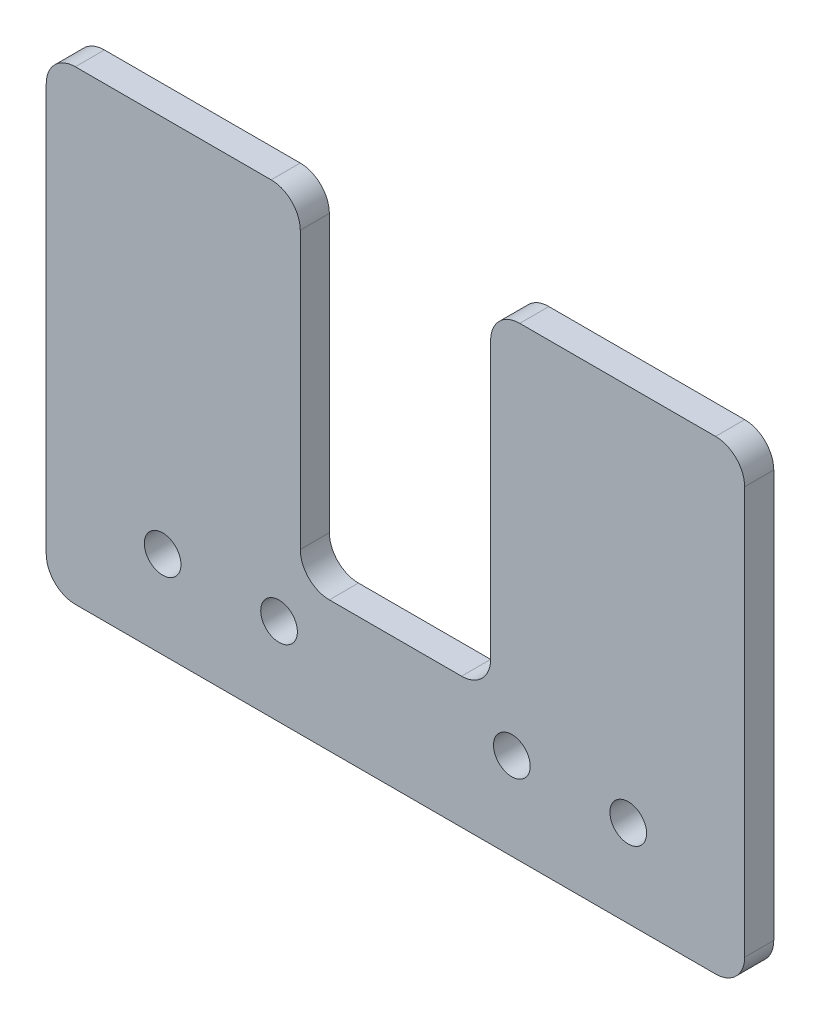
ISO-10303-21;
HEADER;
FILE_DESCRIPTION(('STEP AP214'),'2;1');
FILE_NAME('part.step','',(''),(''),'','','');
FILE_SCHEMA(('AUTOMOTIVE_DESIGN { 1 0 10303 214 1 1 1 1 }'));
ENDSEC;
DATA;
#1=APPLICATION_CONTEXT('core data for automotive mechanical design processes');
#2=APPLICATION_PROTOCOL_DEFINITION('international standard','automotive_design',2000,#1);
#3=PRODUCT_CONTEXT('',#1,'mechanical');
#4=PRODUCT('Part','Part','',(#3));
#5=PRODUCT_RELATED_PRODUCT_CATEGORY('part','',(#4));
#6=PRODUCT_DEFINITION_FORMATION('','',#4);
#7=PRODUCT_DEFINITION_CONTEXT('part definition',#1,'design');
#8=PRODUCT_DEFINITION('design','',#6,#7);
#9=PRODUCT_DEFINITION_SHAPE('','',#8);
#10=(LENGTH_UNIT() NAMED_UNIT(*) SI_UNIT(.MILLI.,.METRE.));
#11=(NAMED_UNIT(*) PLANE_ANGLE_UNIT() SI_UNIT($,.RADIAN.));
#12=(NAMED_UNIT(*) SI_UNIT($,.STERADIAN.) SOLID_ANGLE_UNIT());
#13=UNCERTAINTY_MEASURE_WITH_UNIT(LENGTH_MEASURE(1.E-05),#10,'distance_accuracy_value','');
#14=(GEOMETRIC_REPRESENTATION_CONTEXT(3) GLOBAL_UNCERTAINTY_ASSIGNED_CONTEXT((#13)) GLOBAL_UNIT_ASSIGNED_CONTEXT((#10,
#11,#12)) REPRESENTATION_CONTEXT('',''));
#15=CARTESIAN_POINT('',(0.,0.,0.));
#16=DIRECTION('',(0.,0.,1.));
#17=DIRECTION('',(1.,0.,0.));
#18=AXIS2_PLACEMENT_3D('',#15,#16,#17);
#19=CARTESIAN_POINT('',(38.1,0.,-30.95625));
#20=DIRECTION('',(-1.,0.,0.));
#21=DIRECTION('',(0.,0.,1.));
#22=AXIS2_PLACEMENT_3D('',#19,#20,#21);
#23=PLANE('',#22);
#24=DIRECTION('',(0.,-1.,0.));
#25=VECTOR('',#24,1.);
#26=CARTESIAN_POINT('',(38.1,0.,-27.78125));
#27=LINE('',#26,#25);
#28=CARTESIAN_POINT('',(38.1,26.8,-27.78125));
#29=VERTEX_POINT('',#28);
#30=CARTESIAN_POINT('',(38.1,-17.65,-27.78125));
#31=VERTEX_POINT('',#30);
#32=EDGE_CURVE('E221',#29,#31,#27,.T.);
#33=ORIENTED_EDGE('',*,*,#32,.T.);
#34=DIRECTION('',(0.,0.,1.));
#35=VECTOR('',#34,1.);
#36=CARTESIAN_POINT('',(38.1,-17.65,-30.95625));
#37=LINE('',#36,#35);
#38=CARTESIAN_POINT('',(38.1,-17.65,-30.95625));
#39=VERTEX_POINT('',#38);
#40=EDGE_CURVE('E72',#31,#39,#37,.F.);
#41=ORIENTED_EDGE('',*,*,#40,.T.);
#42=DIRECTION('',(0.,-1.,0.));
#43=VECTOR('',#42,1.);
#44=CARTESIAN_POINT('',(38.1,0.,-30.95625));
#45=LINE('',#44,#43);
#46=CARTESIAN_POINT('',(38.1,26.8,-30.95625));
#47=VERTEX_POINT('',#46);
#48=EDGE_CURVE('E291',#47,#39,#45,.T.);
#49=ORIENTED_EDGE('',*,*,#48,.F.);
#50=DIRECTION('',(0.,0.,1.));
#51=VECTOR('',#50,1.);
#52=CARTESIAN_POINT('',(38.1,26.8,-30.95625));
#53=LINE('',#52,#51);
#54=EDGE_CURVE('E208',#47,#29,#53,.T.);
#55=ORIENTED_EDGE('',*,*,#54,.T.);
#56=EDGE_LOOP('',(#33,#41,#49,#55));
#57=FACE_BOUND('',#56,.T.);
#58=ADVANCED_FACE('F49',(#57),#23,.F.);
#59=CARTESIAN_POINT('',(0.,-20.825,-30.95625));
#60=DIRECTION('',(0.,1.,0.));
#61=DIRECTION('',(-1.,0.,0.));
#62=AXIS2_PLACEMENT_3D('',#59,#60,#61);
#63=PLANE('',#62);
#64=DIRECTION('',(-1.,0.,0.));
#65=VECTOR('',#64,1.);
#66=CARTESIAN_POINT('',(0.,-20.825,-30.95625));
#67=LINE('',#66,#65);
#68=CARTESIAN_POINT('',(34.925,-20.825,-30.95625));
#69=VERTEX_POINT('',#68);
#70=CARTESIAN_POINT('',(-34.925,-20.825,-30.95625));
#71=VERTEX_POINT('',#70);
#72=EDGE_CURVE('E170',#69,#71,#67,.T.);
#73=ORIENTED_EDGE('',*,*,#72,.F.);
#74=DIRECTION('',(0.,0.,1.));
#75=VECTOR('',#74,1.);
#76=CARTESIAN_POINT('',(34.925,-20.825,-30.95625));
#77=LINE('',#76,#75);
#78=CARTESIAN_POINT('',(34.925,-20.825,-27.78125));
#79=VERTEX_POINT('',#78);
#80=EDGE_CURVE('E281',#69,#79,#77,.T.);
#81=ORIENTED_EDGE('',*,*,#80,.T.);
#82=DIRECTION('',(-1.,0.,0.));
#83=VECTOR('',#82,1.);
#84=CARTESIAN_POINT('',(0.,-20.825,-27.78125));
#85=LINE('',#84,#83);
#86=CARTESIAN_POINT('',(-34.925,-20.825,-27.78125));
#87=VERTEX_POINT('',#86);
#88=EDGE_CURVE('E223',#79,#87,#85,.T.);
#89=ORIENTED_EDGE('',*,*,#88,.T.);
#90=DIRECTION('',(0.,0.,1.));
#91=VECTOR('',#90,1.);
#92=CARTESIAN_POINT('',(-34.925,-20.825,-30.95625));
#93=LINE('',#92,#91);
#94=EDGE_CURVE('E179',#87,#71,#93,.F.);
#95=ORIENTED_EDGE('',*,*,#94,.T.);
#96=EDGE_LOOP('',(#73,#81,#89,#95));
#97=FACE_BOUND('',#96,.T.);
#98=ADVANCED_FACE('F295',(#97),#63,.F.);
#99=CARTESIAN_POINT('',(-38.1,0.,-30.95625));
#100=DIRECTION('',(1.,0.,0.));
#101=DIRECTION('',(0.,0.,-1.));
#102=AXIS2_PLACEMENT_3D('',#99,#100,#101);
#103=PLANE('',#102);
#104=DIRECTION('',(0.,1.,0.));
#105=VECTOR('',#104,1.);
#106=CARTESIAN_POINT('',(-38.1,0.,-30.95625));
#107=LINE('',#106,#105);
#108=CARTESIAN_POINT('',(-38.1,-17.65,-30.95625));
#109=VERTEX_POINT('',#108);
#110=CARTESIAN_POINT('',(-38.1,26.8,-30.95625));
#111=VERTEX_POINT('',#110);
#112=EDGE_CURVE('E162',#109,#111,#107,.T.);
#113=ORIENTED_EDGE('',*,*,#112,.F.);
#114=DIRECTION('',(0.,0.,1.));
#115=VECTOR('',#114,1.);
#116=CARTESIAN_POINT('',(-38.1,-17.65,-30.95625));
#117=LINE('',#116,#115);
#118=CARTESIAN_POINT('',(-38.1,-17.65,-27.78125));
#119=VERTEX_POINT('',#118);
#120=EDGE_CURVE('E12',#109,#119,#117,.T.);
#121=ORIENTED_EDGE('',*,*,#120,.T.);
#122=DIRECTION('',(0.,1.,0.));
#123=VECTOR('',#122,1.);
#124=CARTESIAN_POINT('',(-38.1,0.,-27.78125));
#125=LINE('',#124,#123);
#126=CARTESIAN_POINT('',(-38.1,26.8,-27.78125));
#127=VERTEX_POINT('',#126);
#128=EDGE_CURVE('E176',#119,#127,#125,.T.);
#129=ORIENTED_EDGE('',*,*,#128,.T.);
#130=DIRECTION('',(0.,0.,1.));
#131=VECTOR('',#130,1.);
#132=CARTESIAN_POINT('',(-38.1,26.8,-30.95625));
#133=LINE('',#132,#131);
#134=EDGE_CURVE('E173',#111,#127,#133,.T.);
#135=ORIENTED_EDGE('',*,*,#134,.F.);
#136=EDGE_LOOP('',(#113,#121,#129,#135));
#137=FACE_BOUND('',#136,.T.);
#138=ADVANCED_FACE('F174',(#137),#103,.F.);
#139=CARTESIAN_POINT('',(-34.925,26.8,-30.95625));
#140=DIRECTION('',(0.,0.,1.));
#141=DIRECTION('',(1.,0.,0.));
#142=AXIS2_PLACEMENT_3D('',#139,#140,#141);
#143=CYLINDRICAL_SURFACE('',#142,3.175);
#144=CARTESIAN_POINT('',(-34.925,26.8,-27.78125));
#145=DIRECTION('',(0.,0.,-1.));
#146=DIRECTION('',(-1.,0.,0.));
#147=AXIS2_PLACEMENT_3D('',#144,#145,#146);
#148=CIRCLE('',#147,3.175);
#149=CARTESIAN_POINT('',(-34.925,29.975,-27.78125));
#150=VERTEX_POINT('',#149);
#151=EDGE_CURVE('E227',#127,#150,#148,.T.);
#152=ORIENTED_EDGE('',*,*,#151,.T.);
#153=DIRECTION('',(0.,0.,1.));
#154=VECTOR('',#153,1.);
#155=CARTESIAN_POINT('',(-34.925,29.975,-30.95625));
#156=LINE('',#155,#154);
#157=CARTESIAN_POINT('',(-34.925,29.975,-30.95625));
#158=VERTEX_POINT('',#157);
#159=EDGE_CURVE('E180',#158,#150,#156,.T.);
#160=ORIENTED_EDGE('',*,*,#159,.F.);
#161=CARTESIAN_POINT('',(-34.925,26.8,-30.95625));
#162=DIRECTION('',(0.,0.,-1.));
#163=DIRECTION('',(-1.,0.,0.));
#164=AXIS2_PLACEMENT_3D('',#161,#162,#163);
#165=CIRCLE('',#164,3.175);
#166=EDGE_CURVE('E166',#111,#158,#165,.T.);
#167=ORIENTED_EDGE('',*,*,#166,.F.);
#168=ORIENTED_EDGE('',*,*,#134,.T.);
#169=EDGE_LOOP('',(#152,#160,#167,#168));
#170=FACE_BOUND('',#169,.T.);
#171=ADVANCED_FACE('F182',(#170),#143,.T.);
#172=CARTESIAN_POINT('',(0.,29.975,-30.95625));
#173=DIRECTION('',(0.,-1.,0.));
#174=DIRECTION('',(0.,0.,-1.));
#175=AXIS2_PLACEMENT_3D('',#172,#173,#174);
#176=PLANE('',#175);
#177=DIRECTION('',(1.,0.,0.));
#178=VECTOR('',#177,1.);
#179=CARTESIAN_POINT('',(0.,29.975,-27.78125));
#180=LINE('',#179,#178);
#181=CARTESIAN_POINT('',(-13.561,29.975,-27.78125));
#182=VERTEX_POINT('',#181);
#183=EDGE_CURVE('E229',#150,#182,#180,.T.);
#184=ORIENTED_EDGE('',*,*,#183,.T.);
#185=DIRECTION('',(0.,0.,1.));
#186=VECTOR('',#185,1.);
#187=CARTESIAN_POINT('',(-13.561,29.975,-30.95625));
#188=LINE('',#187,#186);
#189=CARTESIAN_POINT('',(-13.561,29.975,-30.95625));
#190=VERTEX_POINT('',#189);
#191=EDGE_CURVE('E276',#190,#182,#188,.T.);
#192=ORIENTED_EDGE('',*,*,#191,.F.);
#193=DIRECTION('',(1.,0.,0.));
#194=VECTOR('',#193,1.);
#195=CARTESIAN_POINT('',(0.,29.975,-30.95625));
#196=LINE('',#195,#194);
#197=EDGE_CURVE('E185',#158,#190,#196,.T.);
#198=ORIENTED_EDGE('',*,*,#197,.F.);
#199=ORIENTED_EDGE('',*,*,#159,.T.);
#200=EDGE_LOOP('',(#184,#192,#198,#199));
#201=FACE_BOUND('',#200,.T.);
#202=ADVANCED_FACE('F350',(#201),#176,.F.);
#203=CARTESIAN_POINT('',(-13.561,26.8,-30.95625));
#204=DIRECTION('',(0.,0.,1.));
#205=DIRECTION('',(1.,0.,0.));
#206=AXIS2_PLACEMENT_3D('',#203,#204,#205);
#207=CYLINDRICAL_SURFACE('',#206,3.175);
#208=CARTESIAN_POINT('',(-13.561,26.8,-27.78125));
#209=DIRECTION('',(0.,0.,-1.));
#210=DIRECTION('',(-1.,0.,0.));
#211=AXIS2_PLACEMENT_3D('',#208,#209,#210);
#212=CIRCLE('',#211,3.175);
#213=CARTESIAN_POINT('',(-10.386,26.8,-27.78125));
#214=VERTEX_POINT('',#213);
#215=EDGE_CURVE('E231',#182,#214,#212,.T.);
#216=ORIENTED_EDGE('',*,*,#215,.T.);
#217=DIRECTION('',(0.,0.,1.));
#218=VECTOR('',#217,1.);
#219=CARTESIAN_POINT('',(-10.386,26.8,-30.95625));
#220=LINE('',#219,#218);
#221=CARTESIAN_POINT('',(-10.386,26.8,-30.95625));
#222=VERTEX_POINT('',#221);
#223=EDGE_CURVE('E273',#222,#214,#220,.T.);
#224=ORIENTED_EDGE('',*,*,#223,.F.);
#225=CARTESIAN_POINT('',(-13.561,26.8,-30.95625));
#226=DIRECTION('',(0.,0.,-1.));
#227=DIRECTION('',(-1.,0.,0.));
#228=AXIS2_PLACEMENT_3D('',#225,#226,#227);
#229=CIRCLE('',#228,3.175);
#230=EDGE_CURVE('E187',#190,#222,#229,.T.);
#231=ORIENTED_EDGE('',*,*,#230,.F.);
#232=ORIENTED_EDGE('',*,*,#191,.T.);
#233=EDGE_LOOP('',(#216,#224,#231,#232));
#234=FACE_BOUND('',#233,.T.);
#235=ADVANCED_FACE('F347',(#234),#207,.T.);
#236=CARTESIAN_POINT('',(-10.386,0.,-30.95625));
#237=DIRECTION('',(-1.,0.,0.));
#238=DIRECTION('',(0.,-1.,0.));
#239=AXIS2_PLACEMENT_3D('',#236,#237,#238);
#240=PLANE('',#239);
#241=DIRECTION('',(0.,-1.,0.));
#242=VECTOR('',#241,1.);
#243=CARTESIAN_POINT('',(-10.386,0.,-27.78125));
#244=LINE('',#243,#242);
#245=CARTESIAN_POINT('',(-10.386,-3.36249999999998,-27.78125));
#246=VERTEX_POINT('',#245);
#247=EDGE_CURVE('E233',#214,#246,#244,.T.);
#248=ORIENTED_EDGE('',*,*,#247,.T.);
#249=DIRECTION('',(0.,0.,1.));
#250=VECTOR('',#249,1.);
#251=CARTESIAN_POINT('',(-10.386,-3.36249999999998,-30.95625));
#252=LINE('',#251,#250);
#253=CARTESIAN_POINT('',(-10.386,-3.36249999999998,-30.95625));
#254=VERTEX_POINT('',#253);
#255=EDGE_CURVE('E270',#254,#246,#252,.T.);
#256=ORIENTED_EDGE('',*,*,#255,.F.);
#257=DIRECTION('',(0.,-1.,0.));
#258=VECTOR('',#257,1.);
#259=CARTESIAN_POINT('',(-10.386,0.,-30.95625));
#260=LINE('',#259,#258);
#261=EDGE_CURVE('E192',#222,#254,#260,.T.);
#262=ORIENTED_EDGE('',*,*,#261,.F.);
#263=ORIENTED_EDGE('',*,*,#223,.T.);
#264=EDGE_LOOP('',(#248,#256,#262,#263));
#265=FACE_BOUND('',#264,.T.);
#266=ADVANCED_FACE('F342',(#265),#240,.F.);
#267=CARTESIAN_POINT('',(-7.21099999999999,-3.36249999999998,-30.95625));
#268=DIRECTION('',(0.,0.,1.));
#269=DIRECTION('',(1.,0.,0.));
#270=AXIS2_PLACEMENT_3D('',#267,#268,#269);
#271=CYLINDRICAL_SURFACE('',#270,3.175);
#272=CARTESIAN_POINT('',(-7.21099999999999,-3.36249999999998,-27.78125));
#273=DIRECTION('',(0.,0.,-1.));
#274=DIRECTION('',(-1.,0.,0.));
#275=AXIS2_PLACEMENT_3D('',#272,#273,#274);
#276=CIRCLE('',#275,3.175);
#277=CARTESIAN_POINT('',(-7.21099999999999,-6.53749999999998,-27.78125));
#278=VERTEX_POINT('',#277);
#279=EDGE_CURVE('E235',#246,#278,#276,.F.);
#280=ORIENTED_EDGE('',*,*,#279,.T.);
#281=DIRECTION('',(0.,0.,1.));
#282=VECTOR('',#281,1.);
#283=CARTESIAN_POINT('',(-7.21099999999999,-6.53749999999998,-30.95625));
#284=LINE('',#283,#282);
#285=CARTESIAN_POINT('',(-7.21099999999999,-6.53749999999998,-30.95625));
#286=VERTEX_POINT('',#285);
#287=EDGE_CURVE('E267',#286,#278,#284,.T.);
#288=ORIENTED_EDGE('',*,*,#287,.F.);
#289=CARTESIAN_POINT('',(-7.21099999999999,-3.36249999999998,-30.95625));
#290=DIRECTION('',(0.,0.,-1.));
#291=DIRECTION('',(-1.,0.,0.));
#292=AXIS2_PLACEMENT_3D('',#289,#290,#291);
#293=CIRCLE('',#292,3.175);
#294=EDGE_CURVE('E194',#254,#286,#293,.F.);
#295=ORIENTED_EDGE('',*,*,#294,.F.);
#296=ORIENTED_EDGE('',*,*,#255,.T.);
#297=EDGE_LOOP('',(#280,#288,#295,#296));
#298=FACE_BOUND('',#297,.T.);
#299=ADVANCED_FACE('F336',(#298),#271,.F.);
#300=CARTESIAN_POINT('',(0.,-6.53749999999998,-30.95625));
#301=DIRECTION('',(0.,-1.,0.));
#302=DIRECTION('',(0.,0.,-1.));
#303=AXIS2_PLACEMENT_3D('',#300,#301,#302);
#304=PLANE('',#303);
#305=DIRECTION('',(1.,0.,0.));
#306=VECTOR('',#305,1.);
#307=CARTESIAN_POINT('',(0.,-6.53749999999998,-27.78125));
#308=LINE('',#307,#306);
#309=CARTESIAN_POINT('',(7.21099999999999,-6.53749999999998,-27.78125));
#310=VERTEX_POINT('',#309);
#311=EDGE_CURVE('E237',#278,#310,#308,.T.);
#312=ORIENTED_EDGE('',*,*,#311,.T.);
#313=DIRECTION('',(0.,0.,1.));
#314=VECTOR('',#313,1.);
#315=CARTESIAN_POINT('',(7.21099999999999,-6.53749999999998,-30.95625));
#316=LINE('',#315,#314);
#317=CARTESIAN_POINT('',(7.21099999999999,-6.53749999999998,-30.95625));
#318=VERTEX_POINT('',#317);
#319=EDGE_CURVE('E264',#318,#310,#316,.T.);
#320=ORIENTED_EDGE('',*,*,#319,.F.);
#321=DIRECTION('',(1.,0.,0.));
#322=VECTOR('',#321,1.);
#323=CARTESIAN_POINT('',(0.,-6.53749999999998,-30.95625));
#324=LINE('',#323,#322);
#325=EDGE_CURVE('E196',#286,#318,#324,.T.);
#326=ORIENTED_EDGE('',*,*,#325,.F.);
#327=ORIENTED_EDGE('',*,*,#287,.T.);
#328=EDGE_LOOP('',(#312,#320,#326,#327));
#329=FACE_BOUND('',#328,.T.);
#330=ADVANCED_FACE('F332',(#329),#304,.F.);
#331=CARTESIAN_POINT('',(7.21099999999999,-3.36249999999998,-30.95625));
#332=DIRECTION('',(0.,0.,1.));
#333=DIRECTION('',(1.,0.,0.));
#334=AXIS2_PLACEMENT_3D('',#331,#332,#333);
#335=CYLINDRICAL_SURFACE('',#334,3.175);
#336=CARTESIAN_POINT('',(7.21099999999999,-3.36249999999998,-27.78125));
#337=DIRECTION('',(0.,0.,-1.));
#338=DIRECTION('',(-1.,0.,0.));
#339=AXIS2_PLACEMENT_3D('',#336,#337,#338);
#340=CIRCLE('',#339,3.175);
#341=CARTESIAN_POINT('',(10.386,-3.36249999999998,-27.78125));
#342=VERTEX_POINT('',#341);
#343=EDGE_CURVE('E239',#310,#342,#340,.F.);
#344=ORIENTED_EDGE('',*,*,#343,.T.);
#345=DIRECTION('',(0.,0.,1.));
#346=VECTOR('',#345,1.);
#347=CARTESIAN_POINT('',(10.386,-3.36249999999998,-30.95625));
#348=LINE('',#347,#346);
#349=CARTESIAN_POINT('',(10.386,-3.36249999999998,-30.95625));
#350=VERTEX_POINT('',#349);
#351=EDGE_CURVE('E261',#350,#342,#348,.T.);
#352=ORIENTED_EDGE('',*,*,#351,.F.);
#353=CARTESIAN_POINT('',(7.21099999999999,-3.36249999999998,-30.95625));
#354=DIRECTION('',(0.,0.,-1.));
#355=DIRECTION('',(-1.,0.,0.));
#356=AXIS2_PLACEMENT_3D('',#353,#354,#355);
#357=CIRCLE('',#356,3.175);
#358=EDGE_CURVE('E198',#318,#350,#357,.F.);
#359=ORIENTED_EDGE('',*,*,#358,.F.);
#360=ORIENTED_EDGE('',*,*,#319,.T.);
#361=EDGE_LOOP('',(#344,#352,#359,#360));
#362=FACE_BOUND('',#361,.T.);
#363=ADVANCED_FACE('F327',(#362),#335,.F.);
#364=CARTESIAN_POINT('',(10.386,0.,-30.95625));
#365=DIRECTION('',(1.,0.,0.));
#366=DIRECTION('',(0.,0.,-1.));
#367=AXIS2_PLACEMENT_3D('',#364,#365,#366);
#368=PLANE('',#367);
#369=DIRECTION('',(0.,1.,0.));
#370=VECTOR('',#369,1.);
#371=CARTESIAN_POINT('',(10.386,0.,-27.78125));
#372=LINE('',#371,#370);
#373=CARTESIAN_POINT('',(10.386,26.8,-27.78125));
#374=VERTEX_POINT('',#373);
#375=EDGE_CURVE('E241',#342,#374,#372,.T.);
#376=ORIENTED_EDGE('',*,*,#375,.T.);
#377=DIRECTION('',(0.,0.,1.));
#378=VECTOR('',#377,1.);
#379=CARTESIAN_POINT('',(10.386,26.8,-30.95625));
#380=LINE('',#379,#378);
#381=CARTESIAN_POINT('',(10.386,26.8,-30.95625));
#382=VERTEX_POINT('',#381);
#383=EDGE_CURVE('E258',#382,#374,#380,.T.);
#384=ORIENTED_EDGE('',*,*,#383,.F.);
#385=DIRECTION('',(0.,1.,0.));
#386=VECTOR('',#385,1.);
#387=CARTESIAN_POINT('',(10.386,0.,-30.95625));
#388=LINE('',#387,#386);
#389=EDGE_CURVE('E200',#350,#382,#388,.T.);
#390=ORIENTED_EDGE('',*,*,#389,.F.);
#391=ORIENTED_EDGE('',*,*,#351,.T.);
#392=EDGE_LOOP('',(#376,#384,#390,#391));
#393=FACE_BOUND('',#392,.T.);
#394=ADVANCED_FACE('F321',(#393),#368,.F.);
#395=CARTESIAN_POINT('',(13.561,26.8,-30.95625));
#396=DIRECTION('',(0.,0.,1.));
#397=DIRECTION('',(1.,0.,0.));
#398=AXIS2_PLACEMENT_3D('',#395,#396,#397);
#399=CYLINDRICAL_SURFACE('',#398,3.175);
#400=CARTESIAN_POINT('',(13.561,26.8,-27.78125));
#401=DIRECTION('',(0.,0.,-1.));
#402=DIRECTION('',(-1.,0.,0.));
#403=AXIS2_PLACEMENT_3D('',#400,#401,#402);
#404=CIRCLE('',#403,3.175);
#405=CARTESIAN_POINT('',(13.561,29.975,-27.78125));
#406=VERTEX_POINT('',#405);
#407=EDGE_CURVE('E243',#374,#406,#404,.T.);
#408=ORIENTED_EDGE('',*,*,#407,.T.);
#409=DIRECTION('',(0.,0.,1.));
#410=VECTOR('',#409,1.);
#411=CARTESIAN_POINT('',(13.561,29.975,-30.95625));
#412=LINE('',#411,#410);
#413=CARTESIAN_POINT('',(13.561,29.975,-30.95625));
#414=VERTEX_POINT('',#413);
#415=EDGE_CURVE('E255',#414,#406,#412,.T.);
#416=ORIENTED_EDGE('',*,*,#415,.F.);
#417=CARTESIAN_POINT('',(13.561,26.8,-30.95625));
#418=DIRECTION('',(0.,0.,-1.));
#419=DIRECTION('',(-1.,0.,0.));
#420=AXIS2_PLACEMENT_3D('',#417,#418,#419);
#421=CIRCLE('',#420,3.175);
#422=EDGE_CURVE('E202',#382,#414,#421,.T.);
#423=ORIENTED_EDGE('',*,*,#422,.F.);
#424=ORIENTED_EDGE('',*,*,#383,.T.);
#425=EDGE_LOOP('',(#408,#416,#423,#424));
#426=FACE_BOUND('',#425,.T.);
#427=ADVANCED_FACE('F317',(#426),#399,.T.);
#428=CARTESIAN_POINT('',(0.,29.975,-30.95625));
#429=DIRECTION('',(0.,-1.,0.));
#430=DIRECTION('',(1.,0.,0.));
#431=AXIS2_PLACEMENT_3D('',#428,#429,#430);
#432=PLANE('',#431);
#433=DIRECTION('',(1.,0.,0.));
#434=VECTOR('',#433,1.);
#435=CARTESIAN_POINT('',(0.,29.975,-27.78125));
#436=LINE('',#435,#434);
#437=CARTESIAN_POINT('',(34.925,29.975,-27.78125));
#438=VERTEX_POINT('',#437);
#439=EDGE_CURVE('E245',#406,#438,#436,.T.);
#440=ORIENTED_EDGE('',*,*,#439,.T.);
#441=DIRECTION('',(0.,0.,1.));
#442=VECTOR('',#441,1.);
#443=CARTESIAN_POINT('',(34.925,29.975,-30.95625));
#444=LINE('',#443,#442);
#445=CARTESIAN_POINT('',(34.925,29.975,-30.95625));
#446=VERTEX_POINT('',#445);
#447=EDGE_CURVE('E252',#446,#438,#444,.T.);
#448=ORIENTED_EDGE('',*,*,#447,.F.);
#449=DIRECTION('',(1.,0.,0.));
#450=VECTOR('',#449,1.);
#451=CARTESIAN_POINT('',(0.,29.975,-30.95625));
#452=LINE('',#451,#450);
#453=EDGE_CURVE('E204',#414,#446,#452,.T.);
#454=ORIENTED_EDGE('',*,*,#453,.F.);
#455=ORIENTED_EDGE('',*,*,#415,.T.);
#456=EDGE_LOOP('',(#440,#448,#454,#455));
#457=FACE_BOUND('',#456,.T.);
#458=ADVANCED_FACE('F312',(#457),#432,.F.);
#459=CARTESIAN_POINT('',(25.4,-11.3,-30.95625));
#460=DIRECTION('',(0.,0.,1.));
#461=DIRECTION('',(1.,0.,0.));
#462=AXIS2_PLACEMENT_3D('',#459,#460,#461);
#463=CYLINDRICAL_SURFACE('',#462,2.);
#464=CARTESIAN_POINT('',(25.4,-11.3,-30.95625));
#465=DIRECTION('',(0.,0.,-1.));
#466=DIRECTION('',(-1.,0.,0.));
#467=AXIS2_PLACEMENT_3D('',#464,#465,#466);
#468=CIRCLE('',#467,2.);
#469=CARTESIAN_POINT('',(23.4,-11.3,-30.95625));
#470=VERTEX_POINT('',#469);
#471=EDGE_CURVE('E599',#470,#470,#468,.T.);
#472=ORIENTED_EDGE('',*,*,#471,.T.);
#473=EDGE_LOOP('',(#472));
#474=FACE_BOUND('',#473,.T.);
#475=CARTESIAN_POINT('',(25.4,-11.3,-27.78125));
#476=DIRECTION('',(0.,0.,-1.));
#477=DIRECTION('',(-1.,0.,0.));
#478=AXIS2_PLACEMENT_3D('',#475,#476,#477);
#479=CIRCLE('',#478,2.);
#480=CARTESIAN_POINT('',(23.4,-11.3,-27.78125));
#481=VERTEX_POINT('',#480);
#482=EDGE_CURVE('E218',#481,#481,#479,.T.);
#483=ORIENTED_EDGE('',*,*,#482,.F.);
#484=EDGE_LOOP('',(#483));
#485=FACE_BOUND('',#484,.T.);
#486=ADVANCED_FACE('F365',(#474,#485),#463,.F.);
#487=CARTESIAN_POINT('',(12.7,-11.3,-30.95625));
#488=DIRECTION('',(0.,0.,1.));
#489=DIRECTION('',(1.,0.,0.));
#490=AXIS2_PLACEMENT_3D('',#487,#488,#489);
#491=CYLINDRICAL_SURFACE('',#490,2.);
#492=CARTESIAN_POINT('',(12.7,-11.3,-30.95625));
#493=DIRECTION('',(0.,0.,-1.));
#494=DIRECTION('',(-1.,0.,0.));
#495=AXIS2_PLACEMENT_3D('',#492,#493,#494);
#496=CIRCLE('',#495,2.);
#497=CARTESIAN_POINT('',(10.7,-11.3,-30.95625));
#498=VERTEX_POINT('',#497);
#499=EDGE_CURVE('E596',#498,#498,#496,.T.);
#500=ORIENTED_EDGE('',*,*,#499,.T.);
#501=EDGE_LOOP('',(#500));
#502=FACE_BOUND('',#501,.T.);
#503=CARTESIAN_POINT('',(12.7,-11.3,-27.78125));
#504=DIRECTION('',(0.,0.,-1.));
#505=DIRECTION('',(-1.,0.,0.));
#506=AXIS2_PLACEMENT_3D('',#503,#504,#505);
#507=CIRCLE('',#506,2.);
#508=CARTESIAN_POINT('',(10.7,-11.3,-27.78125));
#509=VERTEX_POINT('',#508);
#510=EDGE_CURVE('E215',#509,#509,#507,.T.);
#511=ORIENTED_EDGE('',*,*,#510,.F.);
#512=EDGE_LOOP('',(#511));
#513=FACE_BOUND('',#512,.T.);
#514=ADVANCED_FACE('F368',(#502,#513),#491,.F.);
#515=CARTESIAN_POINT('',(-12.7,-11.3,-30.95625));
#516=DIRECTION('',(0.,0.,1.));
#517=DIRECTION('',(1.,0.,0.));
#518=AXIS2_PLACEMENT_3D('',#515,#516,#517);
#519=CYLINDRICAL_SURFACE('',#518,2.);
#520=CARTESIAN_POINT('',(-12.7,-11.3,-30.95625));
#521=DIRECTION('',(0.,0.,-1.));
#522=DIRECTION('',(-1.,0.,0.));
#523=AXIS2_PLACEMENT_3D('',#520,#521,#522);
#524=CIRCLE('',#523,2.);
#525=CARTESIAN_POINT('',(-14.7,-11.3,-30.95625));
#526=VERTEX_POINT('',#525);
#527=EDGE_CURVE('E592',#526,#526,#524,.T.);
#528=ORIENTED_EDGE('',*,*,#527,.T.);
#529=EDGE_LOOP('',(#528));
#530=FACE_BOUND('',#529,.T.);
#531=CARTESIAN_POINT('',(-12.7,-11.3,-27.78125));
#532=DIRECTION('',(0.,0.,-1.));
#533=DIRECTION('',(-1.,0.,0.));
#534=AXIS2_PLACEMENT_3D('',#531,#532,#533);
#535=CIRCLE('',#534,2.);
#536=CARTESIAN_POINT('',(-14.7,-11.3,-27.78125));
#537=VERTEX_POINT('',#536);
#538=EDGE_CURVE('E212',#537,#537,#535,.T.);
#539=ORIENTED_EDGE('',*,*,#538,.F.);
#540=EDGE_LOOP('',(#539));
#541=FACE_BOUND('',#540,.T.);
#542=ADVANCED_FACE('F372',(#530,#541),#519,.F.);
#543=CARTESIAN_POINT('',(-25.4,-11.3,-30.95625));
#544=DIRECTION('',(0.,0.,1.));
#545=DIRECTION('',(1.,0.,0.));
#546=AXIS2_PLACEMENT_3D('',#543,#544,#545);
#547=CYLINDRICAL_SURFACE('',#546,2.);
#548=CARTESIAN_POINT('',(-25.4,-11.3,-30.95625));
#549=DIRECTION('',(0.,0.,-1.));
#550=DIRECTION('',(-1.,0.,0.));
#551=AXIS2_PLACEMENT_3D('',#548,#549,#550);
#552=CIRCLE('',#551,2.);
#553=CARTESIAN_POINT('',(-27.4,-11.3,-30.95625));
#554=VERTEX_POINT('',#553);
#555=EDGE_CURVE('E249',#554,#554,#552,.T.);
#556=ORIENTED_EDGE('',*,*,#555,.T.);
#557=EDGE_LOOP('',(#556));
#558=FACE_BOUND('',#557,.T.);
#559=CARTESIAN_POINT('',(-25.4,-11.3,-27.78125));
#560=DIRECTION('',(0.,0.,-1.));
#561=DIRECTION('',(-1.,0.,0.));
#562=AXIS2_PLACEMENT_3D('',#559,#560,#561);
#563=CIRCLE('',#562,2.);
#564=CARTESIAN_POINT('',(-27.4,-11.3,-27.78125));
#565=VERTEX_POINT('',#564);
#566=EDGE_CURVE('E209',#565,#565,#563,.T.);
#567=ORIENTED_EDGE('',*,*,#566,.F.);
#568=EDGE_LOOP('',(#567));
#569=FACE_BOUND('',#568,.T.);
#570=ADVANCED_FACE('F376',(#558,#569),#547,.F.);
#571=CARTESIAN_POINT('',(34.925,26.8,-30.95625));
#572=DIRECTION('',(0.,0.,1.));
#573=DIRECTION('',(1.,0.,0.));
#574=AXIS2_PLACEMENT_3D('',#571,#572,#573);
#575=CYLINDRICAL_SURFACE('',#574,3.175);
#576=CARTESIAN_POINT('',(34.925,26.8,-27.78125));
#577=DIRECTION('',(0.,0.,-1.));
#578=DIRECTION('',(-1.,0.,0.));
#579=AXIS2_PLACEMENT_3D('',#576,#577,#578);
#580=CIRCLE('',#579,3.175);
#581=EDGE_CURVE('E247',#438,#29,#580,.T.);
#582=ORIENTED_EDGE('',*,*,#581,.T.);
#583=ORIENTED_EDGE('',*,*,#54,.F.);
#584=CARTESIAN_POINT('',(34.925,26.8,-30.95625));
#585=DIRECTION('',(0.,0.,-1.));
#586=DIRECTION('',(-1.,0.,0.));
#587=AXIS2_PLACEMENT_3D('',#584,#585,#586);
#588=CIRCLE('',#587,3.175);
#589=EDGE_CURVE('E206',#446,#47,#588,.T.);
#590=ORIENTED_EDGE('',*,*,#589,.F.);
#591=ORIENTED_EDGE('',*,*,#447,.T.);
#592=EDGE_LOOP('',(#582,#583,#590,#591));
#593=FACE_BOUND('',#592,.T.);
#594=ADVANCED_FACE('F306',(#593),#575,.T.);
#595=CARTESIAN_POINT('',(0.,0.,-30.95625));
#596=DIRECTION('',(0.,0.,-1.));
#597=DIRECTION('',(-1.,0.,0.));
#598=AXIS2_PLACEMENT_3D('',#595,#596,#597);
#599=PLANE('',#598);
#600=ORIENTED_EDGE('',*,*,#555,.F.);
#601=EDGE_LOOP('',(#600));
#602=FACE_BOUND('',#601,.T.);
#603=ORIENTED_EDGE('',*,*,#527,.F.);
#604=EDGE_LOOP('',(#603));
#605=FACE_BOUND('',#604,.T.);
#606=ORIENTED_EDGE('',*,*,#499,.F.);
#607=EDGE_LOOP('',(#606));
#608=FACE_BOUND('',#607,.T.);
#609=ORIENTED_EDGE('',*,*,#471,.F.);
#610=EDGE_LOOP('',(#609));
#611=FACE_BOUND('',#610,.T.);
#612=ORIENTED_EDGE('',*,*,#48,.T.);
#613=CARTESIAN_POINT('',(34.925,-17.65,-30.95625));
#614=DIRECTION('',(0.,0.,-1.));
#615=DIRECTION('',(-1.,0.,0.));
#616=AXIS2_PLACEMENT_3D('',#613,#614,#615);
#617=CIRCLE('',#616,3.175);
#618=EDGE_CURVE('E57',#39,#69,#617,.T.);
#619=ORIENTED_EDGE('',*,*,#618,.T.);
#620=ORIENTED_EDGE('',*,*,#72,.T.);
#621=CARTESIAN_POINT('',(-34.925,-17.65,-30.95625));
#622=DIRECTION('',(0.,0.,-1.));
#623=DIRECTION('',(-1.,0.,0.));
#624=AXIS2_PLACEMENT_3D('',#621,#622,#623);
#625=CIRCLE('',#624,3.175);
#626=EDGE_CURVE('E64',#71,#109,#625,.T.);
#627=ORIENTED_EDGE('',*,*,#626,.T.);
#628=ORIENTED_EDGE('',*,*,#112,.T.);
#629=ORIENTED_EDGE('',*,*,#166,.T.);
#630=ORIENTED_EDGE('',*,*,#197,.T.);
#631=ORIENTED_EDGE('',*,*,#230,.T.);
#632=ORIENTED_EDGE('',*,*,#261,.T.);
#633=ORIENTED_EDGE('',*,*,#294,.T.);
#634=ORIENTED_EDGE('',*,*,#325,.T.);
#635=ORIENTED_EDGE('',*,*,#358,.T.);
#636=ORIENTED_EDGE('',*,*,#389,.T.);
#637=ORIENTED_EDGE('',*,*,#422,.T.);
#638=ORIENTED_EDGE('',*,*,#453,.T.);
#639=ORIENTED_EDGE('',*,*,#589,.T.);
#640=EDGE_LOOP('',(#612,#619,#620,#627,#628,#629,#630,#631,#632,#633,#634,#635,#636,#637,#638,#639));
#641=FACE_BOUND('',#640,.T.);
#642=ADVANCED_FACE('F164',(#602,#605,#608,#611,#641),#599,.T.);
#643=CARTESIAN_POINT('',(0.,0.,-27.78125));
#644=DIRECTION('',(0.,0.,-1.));
#645=DIRECTION('',(-1.,0.,0.));
#646=AXIS2_PLACEMENT_3D('',#643,#644,#645);
#647=PLANE('',#646);
#648=ORIENTED_EDGE('',*,*,#566,.T.);
#649=EDGE_LOOP('',(#648));
#650=FACE_BOUND('',#649,.T.);
#651=ORIENTED_EDGE('',*,*,#538,.T.);
#652=EDGE_LOOP('',(#651));
#653=FACE_BOUND('',#652,.T.);
#654=ORIENTED_EDGE('',*,*,#510,.T.);
#655=EDGE_LOOP('',(#654));
#656=FACE_BOUND('',#655,.T.);
#657=ORIENTED_EDGE('',*,*,#482,.T.);
#658=EDGE_LOOP('',(#657));
#659=FACE_BOUND('',#658,.T.);
#660=ORIENTED_EDGE('',*,*,#88,.F.);
#661=CARTESIAN_POINT('',(34.925,-17.65,-27.78125));
#662=DIRECTION('',(0.,0.,-1.));
#663=DIRECTION('',(-1.,0.,0.));
#664=AXIS2_PLACEMENT_3D('',#661,#662,#663);
#665=CIRCLE('',#664,3.175);
#666=EDGE_CURVE('E286',#79,#31,#665,.F.);
#667=ORIENTED_EDGE('',*,*,#666,.T.);
#668=ORIENTED_EDGE('',*,*,#32,.F.);
#669=ORIENTED_EDGE('',*,*,#581,.F.);
#670=ORIENTED_EDGE('',*,*,#439,.F.);
#671=ORIENTED_EDGE('',*,*,#407,.F.);
#672=ORIENTED_EDGE('',*,*,#375,.F.);
#673=ORIENTED_EDGE('',*,*,#343,.F.);
#674=ORIENTED_EDGE('',*,*,#311,.F.);
#675=ORIENTED_EDGE('',*,*,#279,.F.);
#676=ORIENTED_EDGE('',*,*,#247,.F.);
#677=ORIENTED_EDGE('',*,*,#215,.F.);
#678=ORIENTED_EDGE('',*,*,#183,.F.);
#679=ORIENTED_EDGE('',*,*,#151,.F.);
#680=ORIENTED_EDGE('',*,*,#128,.F.);
#681=CARTESIAN_POINT('',(-34.925,-17.65,-27.78125));
#682=DIRECTION('',(0.,0.,-1.));
#683=DIRECTION('',(-1.,0.,0.));
#684=AXIS2_PLACEMENT_3D('',#681,#682,#683);
#685=CIRCLE('',#684,3.175);
#686=EDGE_CURVE('E284',#119,#87,#685,.F.);
#687=ORIENTED_EDGE('',*,*,#686,.T.);
#688=EDGE_LOOP('',(#660,#667,#668,#669,#670,#671,#672,#673,#674,#675,#676,#677,#678,#679,#680,#687));
#689=FACE_BOUND('',#688,.T.);
#690=ADVANCED_FACE('F301',(#650,#653,#656,#659,#689),#647,.F.);
#691=CARTESIAN_POINT('',(34.925,-17.65,-30.95625));
#692=DIRECTION('',(0.,0.,1.));
#693=DIRECTION('',(1.,0.,0.));
#694=AXIS2_PLACEMENT_3D('',#691,#692,#693);
#695=CYLINDRICAL_SURFACE('',#694,3.175);
#696=ORIENTED_EDGE('',*,*,#618,.F.);
#697=ORIENTED_EDGE('',*,*,#40,.F.);
#698=ORIENTED_EDGE('',*,*,#666,.F.);
#699=ORIENTED_EDGE('',*,*,#80,.F.);
#700=EDGE_LOOP('',(#696,#697,#698,#699));
#701=FACE_BOUND('',#700,.T.);
#702=ADVANCED_FACE('F298',(#701),#695,.T.);
#703=CARTESIAN_POINT('',(-34.925,-17.65,-30.95625));
#704=DIRECTION('',(0.,0.,1.));
#705=DIRECTION('',(1.,0.,0.));
#706=AXIS2_PLACEMENT_3D('',#703,#704,#705);
#707=CYLINDRICAL_SURFACE('',#706,3.175);
#708=ORIENTED_EDGE('',*,*,#626,.F.);
#709=ORIENTED_EDGE('',*,*,#94,.F.);
#710=ORIENTED_EDGE('',*,*,#686,.F.);
#711=ORIENTED_EDGE('',*,*,#120,.F.);
#712=EDGE_LOOP('',(#708,#709,#710,#711));
#713=FACE_BOUND('',#712,.T.);
#714=ADVANCED_FACE('F51',(#713),#707,.T.);
#715=CLOSED_SHELL('',(#58,#98,#138,#171,#202,#235,#266,#299,#330,#363,#394,#427,#458,#486,#514,
#542,#570,#594,#642,#690,#702,#714));
#716=MANIFOLD_SOLID_BREP('B2',#715);
#717=ADVANCED_BREP_SHAPE_REPRESENTATION('',(#18,#716),#14);
#718=SHAPE_DEFINITION_REPRESENTATION(#9,#717);
ENDSEC;
END-ISO-10303-21;
